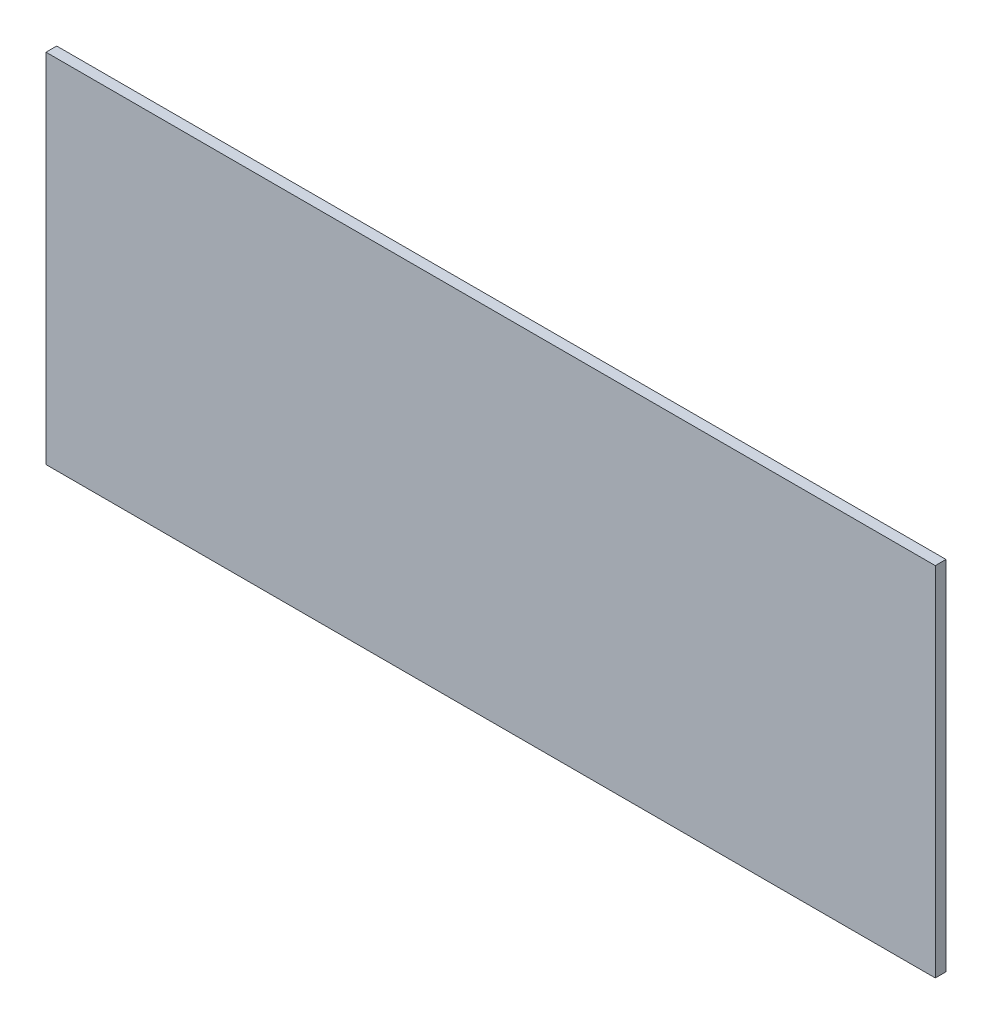
ISO-10303-21;
HEADER;
FILE_DESCRIPTION(('STEP AP214'),'2;1');
FILE_NAME('part.step','',(''),(''),'','','');
FILE_SCHEMA(('AUTOMOTIVE_DESIGN { 1 0 10303 214 1 1 1 1 }'));
ENDSEC;
DATA;
#1=APPLICATION_CONTEXT('core data for automotive mechanical design processes');
#2=APPLICATION_PROTOCOL_DEFINITION('international standard','automotive_design',2000,#1);
#3=PRODUCT_CONTEXT('',#1,'mechanical');
#4=PRODUCT('Part','Part','',(#3));
#5=PRODUCT_RELATED_PRODUCT_CATEGORY('part','',(#4));
#6=PRODUCT_DEFINITION_FORMATION('','',#4);
#7=PRODUCT_DEFINITION_CONTEXT('part definition',#1,'design');
#8=PRODUCT_DEFINITION('design','',#6,#7);
#9=PRODUCT_DEFINITION_SHAPE('','',#8);
#10=(LENGTH_UNIT() NAMED_UNIT(*) SI_UNIT(.MILLI.,.METRE.));
#11=(NAMED_UNIT(*) PLANE_ANGLE_UNIT() SI_UNIT($,.RADIAN.));
#12=(NAMED_UNIT(*) SI_UNIT($,.STERADIAN.) SOLID_ANGLE_UNIT());
#13=UNCERTAINTY_MEASURE_WITH_UNIT(LENGTH_MEASURE(1.E-05),#10,'distance_accuracy_value','');
#14=(GEOMETRIC_REPRESENTATION_CONTEXT(3) GLOBAL_UNCERTAINTY_ASSIGNED_CONTEXT((#13)) GLOBAL_UNIT_ASSIGNED_CONTEXT((#10,
#11,#12)) REPRESENTATION_CONTEXT('',''));
#15=CARTESIAN_POINT('',(0.,0.,0.));
#16=DIRECTION('',(0.,0.,1.));
#17=DIRECTION('',(1.,0.,0.));
#18=AXIS2_PLACEMENT_3D('',#15,#16,#17);
#19=CARTESIAN_POINT('',(0.,0.,1.5));
#20=DIRECTION('',(1.,0.,0.));
#21=DIRECTION('',(0.,0.,-1.));
#22=AXIS2_PLACEMENT_3D('',#19,#20,#21);
#23=PLANE('',#22);
#24=DIRECTION('',(0.,-1.,0.));
#25=VECTOR('',#24,1.);
#26=CARTESIAN_POINT('',(0.,0.,0.));
#27=LINE('',#26,#25);
#28=CARTESIAN_POINT('',(0.,50.,0.));
#29=VERTEX_POINT('',#28);
#30=CARTESIAN_POINT('',(0.,0.,0.));
#31=VERTEX_POINT('',#30);
#32=EDGE_CURVE('E97',#29,#31,#27,.T.);
#33=ORIENTED_EDGE('',*,*,#32,.T.);
#34=DIRECTION('',(0.,0.,-1.));
#35=VECTOR('',#34,1.);
#36=CARTESIAN_POINT('',(0.,0.,1.5));
#37=LINE('',#36,#35);
#38=CARTESIAN_POINT('',(0.,0.,1.5));
#39=VERTEX_POINT('',#38);
#40=EDGE_CURVE('E11',#39,#31,#37,.T.);
#41=ORIENTED_EDGE('',*,*,#40,.F.);
#42=DIRECTION('',(0.,-1.,0.));
#43=VECTOR('',#42,1.);
#44=CARTESIAN_POINT('',(0.,0.,1.5));
#45=LINE('',#44,#43);
#46=CARTESIAN_POINT('',(0.,50.,1.5));
#47=VERTEX_POINT('',#46);
#48=EDGE_CURVE('E85',#47,#39,#45,.T.);
#49=ORIENTED_EDGE('',*,*,#48,.F.);
#50=DIRECTION('',(0.,0.,-1.));
#51=VECTOR('',#50,1.);
#52=CARTESIAN_POINT('',(0.,50.,1.5));
#53=LINE('',#52,#51);
#54=EDGE_CURVE('E93',#47,#29,#53,.T.);
#55=ORIENTED_EDGE('',*,*,#54,.T.);
#56=EDGE_LOOP('',(#33,#41,#49,#55));
#57=FACE_BOUND('',#56,.T.);
#58=ADVANCED_FACE('F34',(#57),#23,.F.);
#59=CARTESIAN_POINT('',(0.,0.,1.5));
#60=DIRECTION('',(0.,1.,0.));
#61=DIRECTION('',(0.,0.,1.));
#62=AXIS2_PLACEMENT_3D('',#59,#60,#61);
#63=PLANE('',#62);
#64=DIRECTION('',(1.,0.,0.));
#65=VECTOR('',#64,1.);
#66=CARTESIAN_POINT('',(0.,0.,0.));
#67=LINE('',#66,#65);
#68=CARTESIAN_POINT('',(124.5,0.,0.));
#69=VERTEX_POINT('',#68);
#70=EDGE_CURVE('E89',#31,#69,#67,.T.);
#71=ORIENTED_EDGE('',*,*,#70,.T.);
#72=DIRECTION('',(0.,0.,-1.));
#73=VECTOR('',#72,1.);
#74=CARTESIAN_POINT('',(124.5,0.,1.5));
#75=LINE('',#74,#73);
#76=CARTESIAN_POINT('',(124.5,0.,1.5));
#77=VERTEX_POINT('',#76);
#78=EDGE_CURVE('E42',#77,#69,#75,.T.);
#79=ORIENTED_EDGE('',*,*,#78,.F.);
#80=DIRECTION('',(1.,0.,0.));
#81=VECTOR('',#80,1.);
#82=CARTESIAN_POINT('',(0.,0.,1.5));
#83=LINE('',#82,#81);
#84=EDGE_CURVE('E80',#39,#77,#83,.T.);
#85=ORIENTED_EDGE('',*,*,#84,.F.);
#86=ORIENTED_EDGE('',*,*,#40,.T.);
#87=EDGE_LOOP('',(#71,#79,#85,#86));
#88=FACE_BOUND('',#87,.T.);
#89=ADVANCED_FACE('F88',(#88),#63,.F.);
#90=CARTESIAN_POINT('',(124.5,0.,1.5));
#91=DIRECTION('',(-1.,0.,0.));
#92=DIRECTION('',(0.,0.,1.));
#93=AXIS2_PLACEMENT_3D('',#90,#91,#92);
#94=PLANE('',#93);
#95=DIRECTION('',(0.,1.,0.));
#96=VECTOR('',#95,1.);
#97=CARTESIAN_POINT('',(124.5,0.,0.));
#98=LINE('',#97,#96);
#99=CARTESIAN_POINT('',(124.5,50.,0.));
#100=VERTEX_POINT('',#99);
#101=EDGE_CURVE('E67',#69,#100,#98,.T.);
#102=ORIENTED_EDGE('',*,*,#101,.T.);
#103=DIRECTION('',(0.,0.,-1.));
#104=VECTOR('',#103,1.);
#105=CARTESIAN_POINT('',(124.5,50.,1.5));
#106=LINE('',#105,#104);
#107=CARTESIAN_POINT('',(124.5,50.,1.5));
#108=VERTEX_POINT('',#107);
#109=EDGE_CURVE('E90',#108,#100,#106,.T.);
#110=ORIENTED_EDGE('',*,*,#109,.F.);
#111=DIRECTION('',(0.,1.,0.));
#112=VECTOR('',#111,1.);
#113=CARTESIAN_POINT('',(124.5,0.,1.5));
#114=LINE('',#113,#112);
#115=EDGE_CURVE('E83',#77,#108,#114,.T.);
#116=ORIENTED_EDGE('',*,*,#115,.F.);
#117=ORIENTED_EDGE('',*,*,#78,.T.);
#118=EDGE_LOOP('',(#102,#110,#116,#117));
#119=FACE_BOUND('',#118,.T.);
#120=ADVANCED_FACE('F91',(#119),#94,.F.);
#121=CARTESIAN_POINT('',(0.,50.,1.5));
#122=DIRECTION('',(0.,-1.,0.));
#123=DIRECTION('',(0.,0.,-1.));
#124=AXIS2_PLACEMENT_3D('',#121,#122,#123);
#125=PLANE('',#124);
#126=DIRECTION('',(-1.,0.,0.));
#127=VECTOR('',#126,1.);
#128=CARTESIAN_POINT('',(0.,50.,0.));
#129=LINE('',#128,#127);
#130=EDGE_CURVE('E73',#100,#29,#129,.T.);
#131=ORIENTED_EDGE('',*,*,#130,.T.);
#132=ORIENTED_EDGE('',*,*,#54,.F.);
#133=DIRECTION('',(-1.,0.,0.));
#134=VECTOR('',#133,1.);
#135=CARTESIAN_POINT('',(0.,50.,1.5));
#136=LINE('',#135,#134);
#137=EDGE_CURVE('E50',#108,#47,#136,.T.);
#138=ORIENTED_EDGE('',*,*,#137,.F.);
#139=ORIENTED_EDGE('',*,*,#109,.T.);
#140=EDGE_LOOP('',(#131,#132,#138,#139));
#141=FACE_BOUND('',#140,.T.);
#142=ADVANCED_FACE('F104',(#141),#125,.F.);
#143=CARTESIAN_POINT('',(0.,0.,1.5));
#144=DIRECTION('',(0.,0.,-1.));
#145=DIRECTION('',(-1.,0.,0.));
#146=AXIS2_PLACEMENT_3D('',#143,#144,#145);
#147=PLANE('',#146);
#148=ORIENTED_EDGE('',*,*,#48,.T.);
#149=ORIENTED_EDGE('',*,*,#84,.T.);
#150=ORIENTED_EDGE('',*,*,#115,.T.);
#151=ORIENTED_EDGE('',*,*,#137,.T.);
#152=EDGE_LOOP('',(#148,#149,#150,#151));
#153=FACE_BOUND('',#152,.T.);
#154=ADVANCED_FACE('F81',(#153),#147,.F.);
#155=CARTESIAN_POINT('',(0.,0.,0.));
#156=DIRECTION('',(0.,0.,-1.));
#157=DIRECTION('',(-1.,0.,0.));
#158=AXIS2_PLACEMENT_3D('',#155,#156,#157);
#159=PLANE('',#158);
#160=ORIENTED_EDGE('',*,*,#32,.F.);
#161=ORIENTED_EDGE('',*,*,#130,.F.);
#162=ORIENTED_EDGE('',*,*,#101,.F.);
#163=ORIENTED_EDGE('',*,*,#70,.F.);
#164=EDGE_LOOP('',(#160,#161,#162,#163));
#165=FACE_BOUND('',#164,.T.);
#166=ADVANCED_FACE('F107',(#165),#159,.T.);
#167=CLOSED_SHELL('',(#58,#89,#120,#142,#154,#166));
#168=MANIFOLD_SOLID_BREP('B2',#167);
#169=ADVANCED_BREP_SHAPE_REPRESENTATION('',(#18,#168),#14);
#170=SHAPE_DEFINITION_REPRESENTATION(#9,#169);
ENDSEC;
END-ISO-10303-21;
